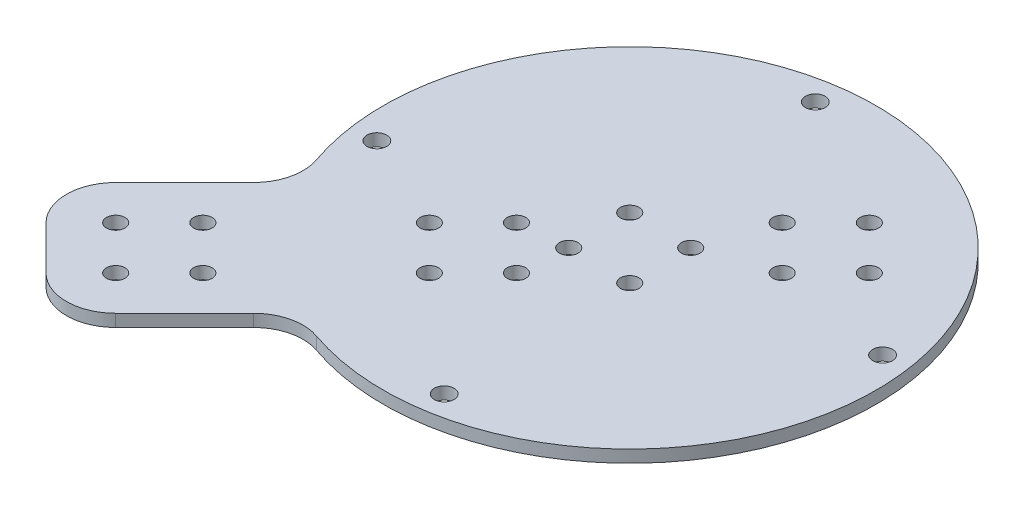
ISO-10303-21;
HEADER;
FILE_DESCRIPTION(('STEP AP214'),'2;1');
FILE_NAME('part.step','',(''),(''),'','','');
FILE_SCHEMA(('AUTOMOTIVE_DESIGN { 1 0 10303 214 1 1 1 1 }'));
ENDSEC;
DATA;
#1=APPLICATION_CONTEXT('core data for automotive mechanical design processes');
#2=APPLICATION_PROTOCOL_DEFINITION('international standard','automotive_design',2000,#1);
#3=PRODUCT_CONTEXT('',#1,'mechanical');
#4=PRODUCT('Part','Part','',(#3));
#5=PRODUCT_RELATED_PRODUCT_CATEGORY('part','',(#4));
#6=PRODUCT_DEFINITION_FORMATION('','',#4);
#7=PRODUCT_DEFINITION_CONTEXT('part definition',#1,'design');
#8=PRODUCT_DEFINITION('design','',#6,#7);
#9=PRODUCT_DEFINITION_SHAPE('','',#8);
#10=(LENGTH_UNIT() NAMED_UNIT(*) SI_UNIT(.MILLI.,.METRE.));
#11=(NAMED_UNIT(*) PLANE_ANGLE_UNIT() SI_UNIT($,.RADIAN.));
#12=(NAMED_UNIT(*) SI_UNIT($,.STERADIAN.) SOLID_ANGLE_UNIT());
#13=UNCERTAINTY_MEASURE_WITH_UNIT(LENGTH_MEASURE(1.E-05),#10,'distance_accuracy_value','');
#14=(GEOMETRIC_REPRESENTATION_CONTEXT(3) GLOBAL_UNCERTAINTY_ASSIGNED_CONTEXT((#13)) GLOBAL_UNIT_ASSIGNED_CONTEXT((#10,
#11,#12)) REPRESENTATION_CONTEXT('',''));
#15=CARTESIAN_POINT('',(0.,0.,0.));
#16=DIRECTION('',(0.,0.,1.));
#17=DIRECTION('',(1.,0.,0.));
#18=AXIS2_PLACEMENT_3D('',#15,#16,#17);
#19=CARTESIAN_POINT('',(-12.7279220618098,2.,5.65685424847547));
#20=DIRECTION('',(0.,-1.,0.));
#21=DIRECTION('',(0.,0.,-1.));
#22=AXIS2_PLACEMENT_3D('',#19,#20,#21);
#23=CYLINDRICAL_SURFACE('',#22,1.5);
#24=CARTESIAN_POINT('',(-12.7279220618098,2.,5.65685424847547));
#25=DIRECTION('',(0.,1.,0.));
#26=DIRECTION('',(0.,0.,1.));
#27=AXIS2_PLACEMENT_3D('',#24,#25,#26);
#28=CIRCLE('',#27,1.5);
#29=CARTESIAN_POINT('',(-12.7279220618098,2.,7.15685424847547));
#30=VERTEX_POINT('',#29);
#31=EDGE_CURVE('E368',#30,#30,#28,.T.);
#32=ORIENTED_EDGE('',*,*,#31,.T.);
#33=EDGE_LOOP('',(#32));
#34=FACE_BOUND('',#33,.T.);
#35=CARTESIAN_POINT('',(-12.7279220618098,0.,5.65685424847547));
#36=DIRECTION('',(0.,1.,0.));
#37=DIRECTION('',(0.,0.,1.));
#38=AXIS2_PLACEMENT_3D('',#35,#36,#37);
#39=CIRCLE('',#38,1.5);
#40=CARTESIAN_POINT('',(-12.7279220618098,0.,7.15685424847547));
#41=VERTEX_POINT('',#40);
#42=EDGE_CURVE('E145',#41,#41,#39,.T.);
#43=ORIENTED_EDGE('',*,*,#42,.F.);
#44=EDGE_LOOP('',(#43));
#45=FACE_BOUND('',#44,.T.);
#46=ADVANCED_FACE('F47',(#34,#45),#23,.F.);
#47=CARTESIAN_POINT('',(-5.65685424847542,2.,12.7279220618098));
#48=DIRECTION('',(0.,-1.,0.));
#49=DIRECTION('',(0.,0.,-1.));
#50=AXIS2_PLACEMENT_3D('',#47,#48,#49);
#51=CYLINDRICAL_SURFACE('',#50,1.5);
#52=CARTESIAN_POINT('',(-5.65685424847542,2.,12.7279220618098));
#53=DIRECTION('',(0.,1.,0.));
#54=DIRECTION('',(0.,0.,1.));
#55=AXIS2_PLACEMENT_3D('',#52,#53,#54);
#56=CIRCLE('',#55,1.5);
#57=CARTESIAN_POINT('',(-5.65685424847542,2.,14.2279220618098));
#58=VERTEX_POINT('',#57);
#59=EDGE_CURVE('E364',#58,#58,#56,.T.);
#60=ORIENTED_EDGE('',*,*,#59,.T.);
#61=EDGE_LOOP('',(#60));
#62=FACE_BOUND('',#61,.T.);
#63=CARTESIAN_POINT('',(-5.65685424847542,0.,12.7279220618098));
#64=DIRECTION('',(0.,1.,0.));
#65=DIRECTION('',(0.,0.,1.));
#66=AXIS2_PLACEMENT_3D('',#63,#64,#65);
#67=CIRCLE('',#66,1.5);
#68=CARTESIAN_POINT('',(-5.65685424847542,0.,14.2279220618098));
#69=VERTEX_POINT('',#68);
#70=EDGE_CURVE('E153',#69,#69,#67,.T.);
#71=ORIENTED_EDGE('',*,*,#70,.F.);
#72=EDGE_LOOP('',(#71));
#73=FACE_BOUND('',#72,.T.);
#74=ADVANCED_FACE('F209',(#62,#73),#51,.F.);
#75=CARTESIAN_POINT('',(-19.7989898736917,2.,12.7279220606293));
#76=DIRECTION('',(0.,-1.,0.));
#77=DIRECTION('',(0.,0.,-1.));
#78=AXIS2_PLACEMENT_3D('',#75,#76,#77);
#79=CYLINDRICAL_SURFACE('',#78,1.5);
#80=CARTESIAN_POINT('',(-19.7989898736917,2.,12.7279220606293));
#81=DIRECTION('',(0.,1.,0.));
#82=DIRECTION('',(0.,0.,1.));
#83=AXIS2_PLACEMENT_3D('',#80,#81,#82);
#84=CIRCLE('',#83,1.5);
#85=CARTESIAN_POINT('',(-19.7989898736917,2.,14.2279220606293));
#86=VERTEX_POINT('',#85);
#87=EDGE_CURVE('E360',#86,#86,#84,.T.);
#88=ORIENTED_EDGE('',*,*,#87,.T.);
#89=EDGE_LOOP('',(#88));
#90=FACE_BOUND('',#89,.T.);
#91=CARTESIAN_POINT('',(-19.7989898736917,0.,12.7279220606293));
#92=DIRECTION('',(0.,1.,0.));
#93=DIRECTION('',(0.,0.,1.));
#94=AXIS2_PLACEMENT_3D('',#91,#92,#93);
#95=CIRCLE('',#94,1.5);
#96=CARTESIAN_POINT('',(-19.7989898736917,0.,14.2279220606293));
#97=VERTEX_POINT('',#96);
#98=EDGE_CURVE('E408',#97,#97,#95,.T.);
#99=ORIENTED_EDGE('',*,*,#98,.F.);
#100=EDGE_LOOP('',(#99));
#101=FACE_BOUND('',#100,.T.);
#102=ADVANCED_FACE('F215',(#90,#101),#79,.F.);
#103=CARTESIAN_POINT('',(-12.7279220606295,2.,19.7989898736915));
#104=DIRECTION('',(0.,-1.,0.));
#105=DIRECTION('',(0.,0.,-1.));
#106=AXIS2_PLACEMENT_3D('',#103,#104,#105);
#107=CYLINDRICAL_SURFACE('',#106,1.5);
#108=CARTESIAN_POINT('',(-12.7279220606295,2.,19.7989898736915));
#109=DIRECTION('',(0.,1.,0.));
#110=DIRECTION('',(0.,0.,1.));
#111=AXIS2_PLACEMENT_3D('',#108,#109,#110);
#112=CIRCLE('',#111,1.5);
#113=CARTESIAN_POINT('',(-12.7279220606295,2.,21.2989898736915));
#114=VERTEX_POINT('',#113);
#115=EDGE_CURVE('E356',#114,#114,#112,.T.);
#116=ORIENTED_EDGE('',*,*,#115,.T.);
#117=EDGE_LOOP('',(#116));
#118=FACE_BOUND('',#117,.T.);
#119=CARTESIAN_POINT('',(-12.7279220606295,0.,19.7989898736915));
#120=DIRECTION('',(0.,1.,0.));
#121=DIRECTION('',(0.,0.,1.));
#122=AXIS2_PLACEMENT_3D('',#119,#120,#121);
#123=CIRCLE('',#122,1.5);
#124=CARTESIAN_POINT('',(-12.7279220606295,0.,21.2989898736915));
#125=VERTEX_POINT('',#124);
#126=EDGE_CURVE('E404',#125,#125,#123,.T.);
#127=ORIENTED_EDGE('',*,*,#126,.F.);
#128=EDGE_LOOP('',(#127));
#129=FACE_BOUND('',#128,.T.);
#130=ADVANCED_FACE('F225',(#118,#129),#107,.F.);
#131=CARTESIAN_POINT('',(4.94974746830582,2.,-4.94974746830584));
#132=DIRECTION('',(0.,-1.,0.));
#133=DIRECTION('',(0.,0.,-1.));
#134=AXIS2_PLACEMENT_3D('',#131,#132,#133);
#135=CYLINDRICAL_SURFACE('',#134,1.5);
#136=CARTESIAN_POINT('',(4.94974746830582,2.,-4.94974746830584));
#137=DIRECTION('',(0.,1.,0.));
#138=DIRECTION('',(0.,0.,1.));
#139=AXIS2_PLACEMENT_3D('',#136,#137,#138);
#140=CIRCLE('',#139,1.5);
#141=CARTESIAN_POINT('',(4.94974746830582,2.,-3.44974746830584));
#142=VERTEX_POINT('',#141);
#143=EDGE_CURVE('E352',#142,#142,#140,.T.);
#144=ORIENTED_EDGE('',*,*,#143,.T.);
#145=EDGE_LOOP('',(#144));
#146=FACE_BOUND('',#145,.T.);
#147=CARTESIAN_POINT('',(4.94974746830582,0.,-4.94974746830584));
#148=DIRECTION('',(0.,1.,0.));
#149=DIRECTION('',(0.,0.,1.));
#150=AXIS2_PLACEMENT_3D('',#147,#148,#149);
#151=CIRCLE('',#150,1.5);
#152=CARTESIAN_POINT('',(4.94974746830582,0.,-3.44974746830584));
#153=VERTEX_POINT('',#152);
#154=EDGE_CURVE('E400',#153,#153,#151,.T.);
#155=ORIENTED_EDGE('',*,*,#154,.F.);
#156=EDGE_LOOP('',(#155));
#157=FACE_BOUND('',#156,.T.);
#158=ADVANCED_FACE('F229',(#146,#157),#135,.F.);
#159=CARTESIAN_POINT('',(-4.94974746830582,2.,-4.94974746830584));
#160=DIRECTION('',(0.,-1.,0.));
#161=DIRECTION('',(0.,0.,-1.));
#162=AXIS2_PLACEMENT_3D('',#159,#160,#161);
#163=CYLINDRICAL_SURFACE('',#162,1.5);
#164=CARTESIAN_POINT('',(-4.94974746830582,2.,-4.94974746830584));
#165=DIRECTION('',(0.,1.,0.));
#166=DIRECTION('',(0.,0.,1.));
#167=AXIS2_PLACEMENT_3D('',#164,#165,#166);
#168=CIRCLE('',#167,1.5);
#169=CARTESIAN_POINT('',(-4.94974746830582,2.,-3.44974746830584));
#170=VERTEX_POINT('',#169);
#171=EDGE_CURVE('E348',#170,#170,#168,.T.);
#172=ORIENTED_EDGE('',*,*,#171,.T.);
#173=EDGE_LOOP('',(#172));
#174=FACE_BOUND('',#173,.T.);
#175=CARTESIAN_POINT('',(-4.94974746830582,0.,-4.94974746830584));
#176=DIRECTION('',(0.,1.,0.));
#177=DIRECTION('',(0.,0.,1.));
#178=AXIS2_PLACEMENT_3D('',#175,#176,#177);
#179=CIRCLE('',#178,1.5);
#180=CARTESIAN_POINT('',(-4.94974746830582,0.,-3.44974746830584));
#181=VERTEX_POINT('',#180);
#182=EDGE_CURVE('E396',#181,#181,#179,.T.);
#183=ORIENTED_EDGE('',*,*,#182,.F.);
#184=EDGE_LOOP('',(#183));
#185=FACE_BOUND('',#184,.T.);
#186=ADVANCED_FACE('F233',(#174,#185),#163,.F.);
#187=CARTESIAN_POINT('',(-4.94974746830582,2.,4.94974746830584));
#188=DIRECTION('',(0.,-1.,0.));
#189=DIRECTION('',(0.,0.,-1.));
#190=AXIS2_PLACEMENT_3D('',#187,#188,#189);
#191=CYLINDRICAL_SURFACE('',#190,1.5);
#192=CARTESIAN_POINT('',(-4.94974746830582,2.,4.94974746830584));
#193=DIRECTION('',(0.,1.,0.));
#194=DIRECTION('',(0.,0.,1.));
#195=AXIS2_PLACEMENT_3D('',#192,#193,#194);
#196=CIRCLE('',#195,1.5);
#197=CARTESIAN_POINT('',(-4.94974746830582,2.,6.44974746830584));
#198=VERTEX_POINT('',#197);
#199=EDGE_CURVE('E344',#198,#198,#196,.T.);
#200=ORIENTED_EDGE('',*,*,#199,.T.);
#201=EDGE_LOOP('',(#200));
#202=FACE_BOUND('',#201,.T.);
#203=CARTESIAN_POINT('',(-4.94974746830582,0.,4.94974746830584));
#204=DIRECTION('',(0.,1.,0.));
#205=DIRECTION('',(0.,0.,1.));
#206=AXIS2_PLACEMENT_3D('',#203,#204,#205);
#207=CIRCLE('',#206,1.5);
#208=CARTESIAN_POINT('',(-4.94974746830582,0.,6.44974746830584));
#209=VERTEX_POINT('',#208);
#210=EDGE_CURVE('E392',#209,#209,#207,.T.);
#211=ORIENTED_EDGE('',*,*,#210,.F.);
#212=EDGE_LOOP('',(#211));
#213=FACE_BOUND('',#212,.T.);
#214=ADVANCED_FACE('F237',(#202,#213),#191,.F.);
#215=CARTESIAN_POINT('',(4.94974746830582,2.,4.94974746830584));
#216=DIRECTION('',(0.,-1.,0.));
#217=DIRECTION('',(0.,0.,-1.));
#218=AXIS2_PLACEMENT_3D('',#215,#216,#217);
#219=CYLINDRICAL_SURFACE('',#218,1.5);
#220=CARTESIAN_POINT('',(4.94974746830582,2.,4.94974746830584));
#221=DIRECTION('',(0.,1.,0.));
#222=DIRECTION('',(0.,0.,1.));
#223=AXIS2_PLACEMENT_3D('',#220,#221,#222);
#224=CIRCLE('',#223,1.5);
#225=CARTESIAN_POINT('',(4.94974746830582,2.,6.44974746830584));
#226=VERTEX_POINT('',#225);
#227=EDGE_CURVE('E340',#226,#226,#224,.T.);
#228=ORIENTED_EDGE('',*,*,#227,.T.);
#229=EDGE_LOOP('',(#228));
#230=FACE_BOUND('',#229,.T.);
#231=CARTESIAN_POINT('',(4.94974746830582,0.,4.94974746830584));
#232=DIRECTION('',(0.,1.,0.));
#233=DIRECTION('',(0.,0.,1.));
#234=AXIS2_PLACEMENT_3D('',#231,#232,#233);
#235=CIRCLE('',#234,1.5);
#236=CARTESIAN_POINT('',(4.94974746830582,0.,6.44974746830584));
#237=VERTEX_POINT('',#236);
#238=EDGE_CURVE('E388',#237,#237,#235,.T.);
#239=ORIENTED_EDGE('',*,*,#238,.F.);
#240=EDGE_LOOP('',(#239));
#241=FACE_BOUND('',#240,.T.);
#242=ADVANCED_FACE('F241',(#230,#241),#219,.F.);
#243=CARTESIAN_POINT('',(35.582997469406,2.,-5.46354199144189));
#244=DIRECTION('',(0.,-1.,0.));
#245=DIRECTION('',(0.,0.,-1.));
#246=AXIS2_PLACEMENT_3D('',#243,#244,#245);
#247=CYLINDRICAL_SURFACE('',#246,1.6);
#248=CARTESIAN_POINT('',(35.582997469406,2.,-5.46354199144189));
#249=DIRECTION('',(0.,1.,0.));
#250=DIRECTION('',(0.,0.,1.));
#251=AXIS2_PLACEMENT_3D('',#248,#249,#250);
#252=CIRCLE('',#251,1.6);
#253=CARTESIAN_POINT('',(35.582997469406,2.,-3.86354199144189));
#254=VERTEX_POINT('',#253);
#255=EDGE_CURVE('E336',#254,#254,#252,.T.);
#256=ORIENTED_EDGE('',*,*,#255,.T.);
#257=EDGE_LOOP('',(#256));
#258=FACE_BOUND('',#257,.T.);
#259=CARTESIAN_POINT('',(35.582997469406,0.,-5.46354199144189));
#260=DIRECTION('',(0.,1.,0.));
#261=DIRECTION('',(0.,0.,1.));
#262=AXIS2_PLACEMENT_3D('',#259,#260,#261);
#263=CIRCLE('',#262,1.6);
#264=CARTESIAN_POINT('',(35.582997469406,0.,-3.86354199144189));
#265=VERTEX_POINT('',#264);
#266=EDGE_CURVE('E384',#265,#265,#263,.T.);
#267=ORIENTED_EDGE('',*,*,#266,.F.);
#268=EDGE_LOOP('',(#267));
#269=FACE_BOUND('',#268,.T.);
#270=ADVANCED_FACE('F245',(#258,#269),#247,.F.);
#271=CARTESIAN_POINT('',(5.46354199144189,2.,35.582997469406));
#272=DIRECTION('',(0.,-1.,0.));
#273=DIRECTION('',(0.,0.,-1.));
#274=AXIS2_PLACEMENT_3D('',#271,#272,#273);
#275=CYLINDRICAL_SURFACE('',#274,1.6);
#276=CARTESIAN_POINT('',(5.46354199144189,2.,35.582997469406));
#277=DIRECTION('',(0.,1.,0.));
#278=DIRECTION('',(0.,0.,1.));
#279=AXIS2_PLACEMENT_3D('',#276,#277,#278);
#280=CIRCLE('',#279,1.6);
#281=CARTESIAN_POINT('',(5.46354199144189,2.,37.182997469406));
#282=VERTEX_POINT('',#281);
#283=EDGE_CURVE('E332',#282,#282,#280,.T.);
#284=ORIENTED_EDGE('',*,*,#283,.T.);
#285=EDGE_LOOP('',(#284));
#286=FACE_BOUND('',#285,.T.);
#287=CARTESIAN_POINT('',(5.46354199144189,0.,35.582997469406));
#288=DIRECTION('',(0.,1.,0.));
#289=DIRECTION('',(0.,0.,1.));
#290=AXIS2_PLACEMENT_3D('',#287,#288,#289);
#291=CIRCLE('',#290,1.6);
#292=CARTESIAN_POINT('',(5.46354199144189,0.,37.182997469406));
#293=VERTEX_POINT('',#292);
#294=EDGE_CURVE('E380',#293,#293,#291,.T.);
#295=ORIENTED_EDGE('',*,*,#294,.F.);
#296=EDGE_LOOP('',(#295));
#297=FACE_BOUND('',#296,.T.);
#298=ADVANCED_FACE('F249',(#286,#297),#275,.F.);
#299=CARTESIAN_POINT('',(-35.582997469406,2.,5.46354199144189));
#300=DIRECTION('',(0.,-1.,0.));
#301=DIRECTION('',(0.,0.,-1.));
#302=AXIS2_PLACEMENT_3D('',#299,#300,#301);
#303=CYLINDRICAL_SURFACE('',#302,1.6);
#304=CARTESIAN_POINT('',(-35.582997469406,2.,5.46354199144189));
#305=DIRECTION('',(0.,1.,0.));
#306=DIRECTION('',(0.,0.,1.));
#307=AXIS2_PLACEMENT_3D('',#304,#305,#306);
#308=CIRCLE('',#307,1.6);
#309=CARTESIAN_POINT('',(-35.582997469406,2.,7.06354199144189));
#310=VERTEX_POINT('',#309);
#311=EDGE_CURVE('E150',#310,#310,#308,.T.);
#312=ORIENTED_EDGE('',*,*,#311,.T.);
#313=EDGE_LOOP('',(#312));
#314=FACE_BOUND('',#313,.T.);
#315=CARTESIAN_POINT('',(-35.582997469406,0.,5.46354199144189));
#316=DIRECTION('',(0.,1.,0.));
#317=DIRECTION('',(0.,0.,1.));
#318=AXIS2_PLACEMENT_3D('',#315,#316,#317);
#319=CIRCLE('',#318,1.6);
#320=CARTESIAN_POINT('',(-35.582997469406,0.,7.06354199144189));
#321=VERTEX_POINT('',#320);
#322=EDGE_CURVE('E376',#321,#321,#319,.T.);
#323=ORIENTED_EDGE('',*,*,#322,.F.);
#324=EDGE_LOOP('',(#323));
#325=FACE_BOUND('',#324,.T.);
#326=ADVANCED_FACE('F253',(#314,#325),#303,.F.);
#327=CARTESIAN_POINT('',(-5.46354199144189,2.,-35.582997469406));
#328=DIRECTION('',(0.,-1.,0.));
#329=DIRECTION('',(0.,0.,-1.));
#330=AXIS2_PLACEMENT_3D('',#327,#328,#329);
#331=CYLINDRICAL_SURFACE('',#330,1.6);
#332=CARTESIAN_POINT('',(-5.46354199144189,2.,-35.582997469406));
#333=DIRECTION('',(0.,1.,0.));
#334=DIRECTION('',(0.,0.,1.));
#335=AXIS2_PLACEMENT_3D('',#332,#333,#334);
#336=CIRCLE('',#335,1.6);
#337=CARTESIAN_POINT('',(-5.46354199144189,2.,-33.982997469406));
#338=VERTEX_POINT('',#337);
#339=EDGE_CURVE('E144',#338,#338,#336,.T.);
#340=ORIENTED_EDGE('',*,*,#339,.T.);
#341=EDGE_LOOP('',(#340));
#342=FACE_BOUND('',#341,.T.);
#343=CARTESIAN_POINT('',(-5.46354199144189,0.,-35.582997469406));
#344=DIRECTION('',(0.,1.,0.));
#345=DIRECTION('',(0.,0.,1.));
#346=AXIS2_PLACEMENT_3D('',#343,#344,#345);
#347=CIRCLE('',#346,1.6);
#348=CARTESIAN_POINT('',(-5.46354199144189,0.,-33.982997469406));
#349=VERTEX_POINT('',#348);
#350=EDGE_CURVE('E301',#349,#349,#347,.T.);
#351=ORIENTED_EDGE('',*,*,#350,.F.);
#352=EDGE_LOOP('',(#351));
#353=FACE_BOUND('',#352,.T.);
#354=ADVANCED_FACE('F257',(#342,#353),#331,.F.);
#355=CARTESIAN_POINT('',(0.,2.,0.));
#356=DIRECTION('',(0.,-1.,0.));
#357=DIRECTION('',(0.,0.,-1.));
#358=AXIS2_PLACEMENT_3D('',#355,#356,#357);
#359=CYLINDRICAL_SURFACE('',#358,40.);
#360=CARTESIAN_POINT('',(0.,2.,0.));
#361=DIRECTION('',(0.,1.,0.));
#362=DIRECTION('',(0.,0.,1.));
#363=AXIS2_PLACEMENT_3D('',#360,#361,#362);
#364=CIRCLE('',#363,40.);
#365=CARTESIAN_POINT('',(-13.0593687647406,2.,37.8081061079039));
#366=VERTEX_POINT('',#365);
#367=CARTESIAN_POINT('',(-37.8081061070648,2.,13.0593687671698));
#368=VERTEX_POINT('',#367);
#369=EDGE_CURVE('E135',#366,#368,#364,.T.);
#370=ORIENTED_EDGE('',*,*,#369,.F.);
#371=DIRECTION('',(0.,-1.,0.));
#372=VECTOR('',#371,1.);
#373=CARTESIAN_POINT('',(-13.0593687647406,2.,37.8081061079039));
#374=LINE('',#373,#372);
#375=CARTESIAN_POINT('',(-13.0593687647406,0.,37.8081061079039));
#376=VERTEX_POINT('',#375);
#377=EDGE_CURVE('E118',#366,#376,#374,.T.);
#378=ORIENTED_EDGE('',*,*,#377,.T.);
#379=CARTESIAN_POINT('',(0.,0.,0.));
#380=DIRECTION('',(0.,1.,0.));
#381=DIRECTION('',(0.,0.,1.));
#382=AXIS2_PLACEMENT_3D('',#379,#380,#381);
#383=CIRCLE('',#382,40.);
#384=CARTESIAN_POINT('',(-37.8081061070648,0.,13.0593687671698));
#385=VERTEX_POINT('',#384);
#386=EDGE_CURVE('E132',#376,#385,#383,.T.);
#387=ORIENTED_EDGE('',*,*,#386,.T.);
#388=DIRECTION('',(0.,-1.,0.));
#389=VECTOR('',#388,1.);
#390=CARTESIAN_POINT('',(-37.8081061070648,2.,13.0593687671698));
#391=LINE('',#390,#389);
#392=EDGE_CURVE('E138',#385,#368,#391,.F.);
#393=ORIENTED_EDGE('',*,*,#392,.T.);
#394=EDGE_LOOP('',(#370,#378,#387,#393));
#395=FACE_BOUND('',#394,.T.);
#396=ADVANCED_FACE('F130',(#395),#359,.T.);
#397=CARTESIAN_POINT('',(0.,2.,0.));
#398=DIRECTION('',(0.,1.,0.));
#399=DIRECTION('',(0.,0.,1.));
#400=AXIS2_PLACEMENT_3D('',#397,#398,#399);
#401=PLANE('',#400);
#402=DIRECTION('',(0.707106781186547,0.,0.707106781186548));
#403=VECTOR('',#402,1.);
#404=CARTESIAN_POINT('',(-38.183766182752,2.,56.5685424955632));
#405=LINE('',#404,#403);
#406=CARTESIAN_POINT('',(-50.9116882441098,2.,43.8406204342053));
#407=VERTEX_POINT('',#406);
#408=CARTESIAN_POINT('',(-43.8406204322443,2.,50.9116882460708));
#409=VERTEX_POINT('',#408);
#410=EDGE_CURVE('E290',#407,#409,#405,.T.);
#411=ORIENTED_EDGE('',*,*,#410,.T.);
#412=CARTESIAN_POINT('',(-38.183766182752,2.,45.2548339965784));
#413=DIRECTION('',(0.,1.,0.));
#414=DIRECTION('',(0.,0.,1.));
#415=AXIS2_PLACEMENT_3D('',#412,#413,#414);
#416=CIRCLE('',#415,8.);
#417=CARTESIAN_POINT('',(-32.5269119332596,2.,50.9116882460708));
#418=VERTEX_POINT('',#417);
#419=EDGE_CURVE('E173',#409,#418,#416,.T.);
#420=ORIENTED_EDGE('',*,*,#419,.T.);
#421=DIRECTION('',(0.707106781186547,0.,-0.707106781186548));
#422=VECTOR('',#421,1.);
#423=CARTESIAN_POINT('',(-38.183766182752,2.,56.5685424955632));
#424=LINE('',#423,#422);
#425=CARTESIAN_POINT('',(-21.3280967671811,2.,39.7128730799923));
#426=VERTEX_POINT('',#425);
#427=EDGE_CURVE('E199',#418,#426,#424,.T.);
#428=ORIENTED_EDGE('',*,*,#427,.T.);
#429=CARTESIAN_POINT('',(-15.6712425176887,2.,45.3697273294847));
#430=DIRECTION('',(0.,1.,0.));
#431=DIRECTION('',(0.,0.,1.));
#432=AXIS2_PLACEMENT_3D('',#429,#430,#431);
#433=CIRCLE('',#432,8.);
#434=EDGE_CURVE('E124',#426,#366,#433,.F.);
#435=ORIENTED_EDGE('',*,*,#434,.T.);
#436=ORIENTED_EDGE('',*,*,#369,.T.);
#437=CARTESIAN_POINT('',(-45.3697273284778,2.,15.6712425206037));
#438=DIRECTION('',(0.,1.,0.));
#439=DIRECTION('',(0.,0.,1.));
#440=AXIS2_PLACEMENT_3D('',#437,#438,#439);
#441=CIRCLE('',#440,8.);
#442=CARTESIAN_POINT('',(-39.7128730789854,2.,21.3280967700961));
#443=VERTEX_POINT('',#442);
#444=EDGE_CURVE('E56',#368,#443,#441,.F.);
#445=ORIENTED_EDGE('',*,*,#444,.T.);
#446=DIRECTION('',(-0.707106781186547,0.,0.707106781186547));
#447=VECTOR('',#446,1.);
#448=CARTESIAN_POINT('',(-56.5685424936022,2.,38.1837661847129));
#449=LINE('',#448,#447);
#450=CARTESIAN_POINT('',(-50.9116882441098,2.,32.5269119352205));
#451=VERTEX_POINT('',#450);
#452=EDGE_CURVE('E193',#443,#451,#449,.T.);
#453=ORIENTED_EDGE('',*,*,#452,.T.);
#454=CARTESIAN_POINT('',(-45.2548339946174,2.,38.1837661847129));
#455=DIRECTION('',(0.,1.,0.));
#456=DIRECTION('',(0.,0.,1.));
#457=AXIS2_PLACEMENT_3D('',#454,#455,#456);
#458=CIRCLE('',#457,8.);
#459=EDGE_CURVE('E170',#451,#407,#458,.T.);
#460=ORIENTED_EDGE('',*,*,#459,.T.);
#461=EDGE_LOOP('',(#411,#420,#428,#435,#436,#445,#453,#460));
#462=FACE_BOUND('',#461,.T.);
#463=CARTESIAN_POINT('',(8.83883476508806,2.,-15.909902576555));
#464=DIRECTION('',(0.,1.,0.));
#465=DIRECTION('',(0.,0.,1.));
#466=AXIS2_PLACEMENT_3D('',#463,#464,#465);
#467=CIRCLE('',#466,1.5);
#468=CARTESIAN_POINT('',(8.83883476508806,2.,-14.409902576555));
#469=VERTEX_POINT('',#468);
#470=EDGE_CURVE('E302',#469,#469,#467,.T.);
#471=ORIENTED_EDGE('',*,*,#470,.F.);
#472=EDGE_LOOP('',(#471));
#473=FACE_BOUND('',#472,.T.);
#474=CARTESIAN_POINT('',(15.9099025765551,2.,-8.8388347650879));
#475=DIRECTION('',(0.,1.,0.));
#476=DIRECTION('',(0.,0.,1.));
#477=AXIS2_PLACEMENT_3D('',#474,#475,#476);
#478=CIRCLE('',#477,1.5);
#479=CARTESIAN_POINT('',(15.9099025765551,2.,-7.33883476508789));
#480=VERTEX_POINT('',#479);
#481=EDGE_CURVE('E306',#480,#480,#478,.T.);
#482=ORIENTED_EDGE('',*,*,#481,.F.);
#483=EDGE_LOOP('',(#482));
#484=FACE_BOUND('',#483,.T.);
#485=CARTESIAN_POINT('',(15.9099025762023,2.,-22.9809703889055));
#486=DIRECTION('',(0.,1.,0.));
#487=DIRECTION('',(0.,0.,1.));
#488=AXIS2_PLACEMENT_3D('',#485,#486,#487);
#489=CIRCLE('',#488,1.5);
#490=CARTESIAN_POINT('',(15.9099025762023,2.,-21.4809703889055));
#491=VERTEX_POINT('',#490);
#492=EDGE_CURVE('E314',#491,#491,#489,.T.);
#493=ORIENTED_EDGE('',*,*,#492,.F.);
#494=EDGE_LOOP('',(#493));
#495=FACE_BOUND('',#494,.T.);
#496=CARTESIAN_POINT('',(22.9809703889056,2.,-15.9099025762021));
#497=DIRECTION('',(0.,1.,0.));
#498=DIRECTION('',(0.,0.,1.));
#499=AXIS2_PLACEMENT_3D('',#496,#497,#498);
#500=CIRCLE('',#499,1.5);
#501=CARTESIAN_POINT('',(22.9809703889056,2.,-14.4099025762021));
#502=VERTEX_POINT('',#501);
#503=EDGE_CURVE('E322',#502,#502,#500,.T.);
#504=ORIENTED_EDGE('',*,*,#503,.F.);
#505=EDGE_LOOP('',(#504));
#506=FACE_BOUND('',#505,.T.);
#507=ORIENTED_EDGE('',*,*,#339,.F.);
#508=EDGE_LOOP('',(#507));
#509=FACE_BOUND('',#508,.T.);
#510=ORIENTED_EDGE('',*,*,#311,.F.);
#511=EDGE_LOOP('',(#510));
#512=FACE_BOUND('',#511,.T.);
#513=ORIENTED_EDGE('',*,*,#283,.F.);
#514=EDGE_LOOP('',(#513));
#515=FACE_BOUND('',#514,.T.);
#516=ORIENTED_EDGE('',*,*,#255,.F.);
#517=EDGE_LOOP('',(#516));
#518=FACE_BOUND('',#517,.T.);
#519=ORIENTED_EDGE('',*,*,#227,.F.);
#520=EDGE_LOOP('',(#519));
#521=FACE_BOUND('',#520,.T.);
#522=ORIENTED_EDGE('',*,*,#199,.F.);
#523=EDGE_LOOP('',(#522));
#524=FACE_BOUND('',#523,.T.);
#525=ORIENTED_EDGE('',*,*,#171,.F.);
#526=EDGE_LOOP('',(#525));
#527=FACE_BOUND('',#526,.T.);
#528=ORIENTED_EDGE('',*,*,#143,.F.);
#529=EDGE_LOOP('',(#528));
#530=FACE_BOUND('',#529,.T.);
#531=ORIENTED_EDGE('',*,*,#115,.F.);
#532=EDGE_LOOP('',(#531));
#533=FACE_BOUND('',#532,.T.);
#534=ORIENTED_EDGE('',*,*,#87,.F.);
#535=EDGE_LOOP('',(#534));
#536=FACE_BOUND('',#535,.T.);
#537=ORIENTED_EDGE('',*,*,#59,.F.);
#538=EDGE_LOOP('',(#537));
#539=FACE_BOUND('',#538,.T.);
#540=ORIENTED_EDGE('',*,*,#31,.F.);
#541=EDGE_LOOP('',(#540));
#542=FACE_BOUND('',#541,.T.);
#543=CARTESIAN_POINT('',(-31.1126983719123,2.,38.1837661843146));
#544=DIRECTION('',(0.,1.,0.));
#545=DIRECTION('',(0.,0.,1.));
#546=AXIS2_PLACEMENT_3D('',#543,#544,#545);
#547=CIRCLE('',#546,1.5);
#548=CARTESIAN_POINT('',(-31.1126983719123,2.,39.6837661843146));
#549=VERTEX_POINT('',#548);
#550=EDGE_CURVE('E452',#549,#549,#547,.T.);
#551=ORIENTED_EDGE('',*,*,#550,.F.);
#552=EDGE_LOOP('',(#551));
#553=FACE_BOUND('',#552,.T.);
#554=CARTESIAN_POINT('',(-38.1837661843145,2.,31.1126983719124));
#555=DIRECTION('',(0.,1.,0.));
#556=DIRECTION('',(0.,0.,1.));
#557=AXIS2_PLACEMENT_3D('',#554,#555,#556);
#558=CIRCLE('',#557,1.5);
#559=CARTESIAN_POINT('',(-38.1837661843145,2.,32.6126983719124));
#560=VERTEX_POINT('',#559);
#561=EDGE_CURVE('E446',#560,#560,#558,.T.);
#562=ORIENTED_EDGE('',*,*,#561,.F.);
#563=EDGE_LOOP('',(#562));
#564=FACE_BOUND('',#563,.T.);
#565=CARTESIAN_POINT('',(-38.1837661801883,2.,45.2548339992172));
#566=DIRECTION('',(0.,1.,0.));
#567=DIRECTION('',(0.,0.,1.));
#568=AXIS2_PLACEMENT_3D('',#565,#566,#567);
#569=CIRCLE('',#568,1.5);
#570=CARTESIAN_POINT('',(-38.1837661801883,2.,46.7548339992172));
#571=VERTEX_POINT('',#570);
#572=EDGE_CURVE('E440',#571,#571,#569,.T.);
#573=ORIENTED_EDGE('',*,*,#572,.F.);
#574=EDGE_LOOP('',(#573));
#575=FACE_BOUND('',#574,.T.);
#576=CARTESIAN_POINT('',(-45.2548339925528,2.,38.1837661880869));
#577=DIRECTION('',(0.,1.,0.));
#578=DIRECTION('',(0.,0.,1.));
#579=AXIS2_PLACEMENT_3D('',#576,#577,#578);
#580=CIRCLE('',#579,1.5);
#581=CARTESIAN_POINT('',(-45.2548339925528,2.,39.6837661880869));
#582=VERTEX_POINT('',#581);
#583=EDGE_CURVE('E284',#582,#582,#580,.T.);
#584=ORIENTED_EDGE('',*,*,#583,.F.);
#585=EDGE_LOOP('',(#584));
#586=FACE_BOUND('',#585,.T.);
#587=ADVANCED_FACE('F191',(#462,#473,#484,#495,#506,#509,#512,#515,#518,#521,#524,#527,#530,
#533,#536,#539,#542,#553,#564,#575,#586),#401,.T.);
#588=CARTESIAN_POINT('',(0.,0.,0.));
#589=DIRECTION('',(0.,1.,0.));
#590=DIRECTION('',(0.,0.,1.));
#591=AXIS2_PLACEMENT_3D('',#588,#589,#590);
#592=PLANE('',#591);
#593=DIRECTION('',(0.707106781186547,0.,-0.707106781186548));
#594=VECTOR('',#593,1.);
#595=CARTESIAN_POINT('',(-38.183766182752,0.,56.5685424955632));
#596=LINE('',#595,#594);
#597=CARTESIAN_POINT('',(-32.5269119332596,0.,50.9116882460708));
#598=VERTEX_POINT('',#597);
#599=CARTESIAN_POINT('',(-21.3280967671811,0.,39.7128730799923));
#600=VERTEX_POINT('',#599);
#601=EDGE_CURVE('E273',#598,#600,#596,.T.);
#602=ORIENTED_EDGE('',*,*,#601,.F.);
#603=CARTESIAN_POINT('',(-38.183766182752,0.,45.2548339965784));
#604=DIRECTION('',(0.,1.,0.));
#605=DIRECTION('',(0.,0.,1.));
#606=AXIS2_PLACEMENT_3D('',#603,#604,#605);
#607=CIRCLE('',#606,8.);
#608=CARTESIAN_POINT('',(-43.8406204322443,0.,50.9116882460708));
#609=VERTEX_POINT('',#608);
#610=EDGE_CURVE('E178',#598,#609,#607,.F.);
#611=ORIENTED_EDGE('',*,*,#610,.T.);
#612=DIRECTION('',(0.707106781186547,0.,0.707106781186548));
#613=VECTOR('',#612,1.);
#614=CARTESIAN_POINT('',(-38.183766182752,0.,56.5685424955632));
#615=LINE('',#614,#613);
#616=CARTESIAN_POINT('',(-50.9116882441098,0.,43.8406204342053));
#617=VERTEX_POINT('',#616);
#618=EDGE_CURVE('E198',#617,#609,#615,.T.);
#619=ORIENTED_EDGE('',*,*,#618,.F.);
#620=CARTESIAN_POINT('',(-45.2548339946174,0.,38.1837661847129));
#621=DIRECTION('',(0.,1.,0.));
#622=DIRECTION('',(0.,0.,1.));
#623=AXIS2_PLACEMENT_3D('',#620,#621,#622);
#624=CIRCLE('',#623,8.);
#625=CARTESIAN_POINT('',(-50.9116882441098,0.,32.5269119352205));
#626=VERTEX_POINT('',#625);
#627=EDGE_CURVE('E63',#617,#626,#624,.F.);
#628=ORIENTED_EDGE('',*,*,#627,.T.);
#629=DIRECTION('',(-0.707106781186547,0.,0.707106781186547));
#630=VECTOR('',#629,1.);
#631=CARTESIAN_POINT('',(-56.5685424936022,0.,38.1837661847129));
#632=LINE('',#631,#630);
#633=CARTESIAN_POINT('',(-39.7128730789854,0.,21.3280967700961));
#634=VERTEX_POINT('',#633);
#635=EDGE_CURVE('E281',#634,#626,#632,.T.);
#636=ORIENTED_EDGE('',*,*,#635,.F.);
#637=CARTESIAN_POINT('',(-45.3697273284778,0.,15.6712425206037));
#638=DIRECTION('',(0.,1.,0.));
#639=DIRECTION('',(0.,0.,1.));
#640=AXIS2_PLACEMENT_3D('',#637,#638,#639);
#641=CIRCLE('',#640,8.);
#642=EDGE_CURVE('E11',#634,#385,#641,.T.);
#643=ORIENTED_EDGE('',*,*,#642,.T.);
#644=ORIENTED_EDGE('',*,*,#386,.F.);
#645=CARTESIAN_POINT('',(-15.6712425176887,0.,45.3697273294847));
#646=DIRECTION('',(0.,1.,0.));
#647=DIRECTION('',(0.,0.,1.));
#648=AXIS2_PLACEMENT_3D('',#645,#646,#647);
#649=CIRCLE('',#648,8.);
#650=EDGE_CURVE('E114',#376,#600,#649,.T.);
#651=ORIENTED_EDGE('',*,*,#650,.T.);
#652=EDGE_LOOP('',(#602,#611,#619,#628,#636,#643,#644,#651));
#653=FACE_BOUND('',#652,.T.);
#654=CARTESIAN_POINT('',(8.83883476508806,0.,-15.909902576555));
#655=DIRECTION('',(0.,1.,0.));
#656=DIRECTION('',(0.,0.,1.));
#657=AXIS2_PLACEMENT_3D('',#654,#655,#656);
#658=CIRCLE('',#657,1.5);
#659=CARTESIAN_POINT('',(8.83883476508806,0.,-14.409902576555));
#660=VERTEX_POINT('',#659);
#661=EDGE_CURVE('E297',#660,#660,#658,.T.);
#662=ORIENTED_EDGE('',*,*,#661,.T.);
#663=EDGE_LOOP('',(#662));
#664=FACE_BOUND('',#663,.T.);
#665=CARTESIAN_POINT('',(15.9099025765551,0.,-8.8388347650879));
#666=DIRECTION('',(0.,1.,0.));
#667=DIRECTION('',(0.,0.,1.));
#668=AXIS2_PLACEMENT_3D('',#665,#666,#667);
#669=CIRCLE('',#668,1.5);
#670=CARTESIAN_POINT('',(15.9099025765551,0.,-7.33883476508789));
#671=VERTEX_POINT('',#670);
#672=EDGE_CURVE('E310',#671,#671,#669,.T.);
#673=ORIENTED_EDGE('',*,*,#672,.T.);
#674=EDGE_LOOP('',(#673));
#675=FACE_BOUND('',#674,.T.);
#676=CARTESIAN_POINT('',(15.9099025762023,0.,-22.9809703889055));
#677=DIRECTION('',(0.,1.,0.));
#678=DIRECTION('',(0.,0.,1.));
#679=AXIS2_PLACEMENT_3D('',#676,#677,#678);
#680=CIRCLE('',#679,1.5);
#681=CARTESIAN_POINT('',(15.9099025762023,0.,-21.4809703889055));
#682=VERTEX_POINT('',#681);
#683=EDGE_CURVE('E318',#682,#682,#680,.T.);
#684=ORIENTED_EDGE('',*,*,#683,.T.);
#685=EDGE_LOOP('',(#684));
#686=FACE_BOUND('',#685,.T.);
#687=CARTESIAN_POINT('',(22.9809703889056,0.,-15.9099025762021));
#688=DIRECTION('',(0.,1.,0.));
#689=DIRECTION('',(0.,0.,1.));
#690=AXIS2_PLACEMENT_3D('',#687,#688,#689);
#691=CIRCLE('',#690,1.5);
#692=CARTESIAN_POINT('',(22.9809703889056,0.,-14.4099025762021));
#693=VERTEX_POINT('',#692);
#694=EDGE_CURVE('E289',#693,#693,#691,.T.);
#695=ORIENTED_EDGE('',*,*,#694,.T.);
#696=EDGE_LOOP('',(#695));
#697=FACE_BOUND('',#696,.T.);
#698=ORIENTED_EDGE('',*,*,#350,.T.);
#699=EDGE_LOOP('',(#698));
#700=FACE_BOUND('',#699,.T.);
#701=ORIENTED_EDGE('',*,*,#322,.T.);
#702=EDGE_LOOP('',(#701));
#703=FACE_BOUND('',#702,.T.);
#704=ORIENTED_EDGE('',*,*,#294,.T.);
#705=EDGE_LOOP('',(#704));
#706=FACE_BOUND('',#705,.T.);
#707=ORIENTED_EDGE('',*,*,#266,.T.);
#708=EDGE_LOOP('',(#707));
#709=FACE_BOUND('',#708,.T.);
#710=ORIENTED_EDGE('',*,*,#238,.T.);
#711=EDGE_LOOP('',(#710));
#712=FACE_BOUND('',#711,.T.);
#713=ORIENTED_EDGE('',*,*,#210,.T.);
#714=EDGE_LOOP('',(#713));
#715=FACE_BOUND('',#714,.T.);
#716=ORIENTED_EDGE('',*,*,#182,.T.);
#717=EDGE_LOOP('',(#716));
#718=FACE_BOUND('',#717,.T.);
#719=ORIENTED_EDGE('',*,*,#154,.T.);
#720=EDGE_LOOP('',(#719));
#721=FACE_BOUND('',#720,.T.);
#722=ORIENTED_EDGE('',*,*,#126,.T.);
#723=EDGE_LOOP('',(#722));
#724=FACE_BOUND('',#723,.T.);
#725=ORIENTED_EDGE('',*,*,#98,.T.);
#726=EDGE_LOOP('',(#725));
#727=FACE_BOUND('',#726,.T.);
#728=ORIENTED_EDGE('',*,*,#70,.T.);
#729=EDGE_LOOP('',(#728));
#730=FACE_BOUND('',#729,.T.);
#731=ORIENTED_EDGE('',*,*,#42,.T.);
#732=EDGE_LOOP('',(#731));
#733=FACE_BOUND('',#732,.T.);
#734=CARTESIAN_POINT('',(-31.1126983719123,0.,38.1837661843146));
#735=DIRECTION('',(0.,1.,0.));
#736=DIRECTION('',(0.,0.,1.));
#737=AXIS2_PLACEMENT_3D('',#734,#735,#736);
#738=CIRCLE('',#737,1.5);
#739=CARTESIAN_POINT('',(-31.1126983719123,0.,39.6837661843146));
#740=VERTEX_POINT('',#739);
#741=EDGE_CURVE('E424',#740,#740,#738,.T.);
#742=ORIENTED_EDGE('',*,*,#741,.T.);
#743=EDGE_LOOP('',(#742));
#744=FACE_BOUND('',#743,.T.);
#745=CARTESIAN_POINT('',(-38.1837661843145,0.,31.1126983719124));
#746=DIRECTION('',(0.,1.,0.));
#747=DIRECTION('',(0.,0.,1.));
#748=AXIS2_PLACEMENT_3D('',#745,#746,#747);
#749=CIRCLE('',#748,1.5);
#750=CARTESIAN_POINT('',(-38.1837661843145,0.,32.6126983719124));
#751=VERTEX_POINT('',#750);
#752=EDGE_CURVE('E428',#751,#751,#749,.T.);
#753=ORIENTED_EDGE('',*,*,#752,.T.);
#754=EDGE_LOOP('',(#753));
#755=FACE_BOUND('',#754,.T.);
#756=CARTESIAN_POINT('',(-38.1837661801883,0.,45.2548339992172));
#757=DIRECTION('',(0.,1.,0.));
#758=DIRECTION('',(0.,0.,1.));
#759=AXIS2_PLACEMENT_3D('',#756,#757,#758);
#760=CIRCLE('',#759,1.5);
#761=CARTESIAN_POINT('',(-38.1837661801883,0.,46.7548339992172));
#762=VERTEX_POINT('',#761);
#763=EDGE_CURVE('E432',#762,#762,#760,.T.);
#764=ORIENTED_EDGE('',*,*,#763,.T.);
#765=EDGE_LOOP('',(#764));
#766=FACE_BOUND('',#765,.T.);
#767=CARTESIAN_POINT('',(-45.2548339925528,0.,38.1837661880869));
#768=DIRECTION('',(0.,1.,0.));
#769=DIRECTION('',(0.,0.,1.));
#770=AXIS2_PLACEMENT_3D('',#767,#768,#769);
#771=CIRCLE('',#770,1.5);
#772=CARTESIAN_POINT('',(-45.2548339925528,0.,39.6837661880869));
#773=VERTEX_POINT('',#772);
#774=EDGE_CURVE('E293',#773,#773,#771,.T.);
#775=ORIENTED_EDGE('',*,*,#774,.T.);
#776=EDGE_LOOP('',(#775));
#777=FACE_BOUND('',#776,.T.);
#778=ADVANCED_FACE('F140',(#653,#664,#675,#686,#697,#700,#703,#706,#709,#712,#715,#718,#721,
#724,#727,#730,#733,#744,#755,#766,#777),#592,.F.);
#779=CARTESIAN_POINT('',(22.9809703889056,0.,-15.9099025762021));
#780=DIRECTION('',(0.,1.,0.));
#781=DIRECTION('',(0.,0.,1.));
#782=AXIS2_PLACEMENT_3D('',#779,#780,#781);
#783=CYLINDRICAL_SURFACE('',#782,1.5);
#784=ORIENTED_EDGE('',*,*,#694,.F.);
#785=EDGE_LOOP('',(#784));
#786=FACE_BOUND('',#785,.T.);
#787=ORIENTED_EDGE('',*,*,#503,.T.);
#788=EDGE_LOOP('',(#787));
#789=FACE_BOUND('',#788,.T.);
#790=ADVANCED_FACE('F418',(#786,#789),#783,.F.);
#791=CARTESIAN_POINT('',(15.9099025762023,0.,-22.9809703889055));
#792=DIRECTION('',(0.,1.,0.));
#793=DIRECTION('',(0.,0.,1.));
#794=AXIS2_PLACEMENT_3D('',#791,#792,#793);
#795=CYLINDRICAL_SURFACE('',#794,1.5);
#796=ORIENTED_EDGE('',*,*,#683,.F.);
#797=EDGE_LOOP('',(#796));
#798=FACE_BOUND('',#797,.T.);
#799=ORIENTED_EDGE('',*,*,#492,.T.);
#800=EDGE_LOOP('',(#799));
#801=FACE_BOUND('',#800,.T.);
#802=ADVANCED_FACE('F496',(#798,#801),#795,.F.);
#803=CARTESIAN_POINT('',(15.9099025765551,0.,-8.8388347650879));
#804=DIRECTION('',(0.,1.,0.));
#805=DIRECTION('',(0.,0.,1.));
#806=AXIS2_PLACEMENT_3D('',#803,#804,#805);
#807=CYLINDRICAL_SURFACE('',#806,1.5);
#808=ORIENTED_EDGE('',*,*,#672,.F.);
#809=EDGE_LOOP('',(#808));
#810=FACE_BOUND('',#809,.T.);
#811=ORIENTED_EDGE('',*,*,#481,.T.);
#812=EDGE_LOOP('',(#811));
#813=FACE_BOUND('',#812,.T.);
#814=ADVANCED_FACE('F492',(#810,#813),#807,.F.);
#815=CARTESIAN_POINT('',(8.83883476508806,0.,-15.909902576555));
#816=DIRECTION('',(0.,1.,0.));
#817=DIRECTION('',(0.,0.,1.));
#818=AXIS2_PLACEMENT_3D('',#815,#816,#817);
#819=CYLINDRICAL_SURFACE('',#818,1.5);
#820=ORIENTED_EDGE('',*,*,#661,.F.);
#821=EDGE_LOOP('',(#820));
#822=FACE_BOUND('',#821,.T.);
#823=ORIENTED_EDGE('',*,*,#470,.T.);
#824=EDGE_LOOP('',(#823));
#825=FACE_BOUND('',#824,.T.);
#826=ADVANCED_FACE('F487',(#822,#825),#819,.F.);
#827=CARTESIAN_POINT('',(-56.5685424936022,0.,38.1837661847129));
#828=DIRECTION('',(-0.707106781186547,0.,-0.707106781186547));
#829=DIRECTION('',(-0.707106781186548,0.,0.707106781186548));
#830=AXIS2_PLACEMENT_3D('',#827,#828,#829);
#831=PLANE('',#830);
#832=ORIENTED_EDGE('',*,*,#635,.T.);
#833=DIRECTION('',(0.,1.,0.));
#834=VECTOR('',#833,1.);
#835=CARTESIAN_POINT('',(-50.9116882441098,0.,32.5269119352205));
#836=LINE('',#835,#834);
#837=EDGE_CURVE('E125',#626,#451,#836,.T.);
#838=ORIENTED_EDGE('',*,*,#837,.T.);
#839=ORIENTED_EDGE('',*,*,#452,.F.);
#840=DIRECTION('',(0.,-1.,0.));
#841=VECTOR('',#840,1.);
#842=CARTESIAN_POINT('',(-39.7128730789854,0.,21.3280967700961));
#843=LINE('',#842,#841);
#844=EDGE_CURVE('E70',#443,#634,#843,.T.);
#845=ORIENTED_EDGE('',*,*,#844,.T.);
#846=EDGE_LOOP('',(#832,#838,#839,#845));
#847=FACE_BOUND('',#846,.T.);
#848=ADVANCED_FACE('F195',(#847),#831,.T.);
#849=CARTESIAN_POINT('',(-38.183766182752,0.,56.5685424955632));
#850=DIRECTION('',(0.707106781186548,0.,0.707106781186547));
#851=DIRECTION('',(0.707106781186547,0.,-0.707106781186548));
#852=AXIS2_PLACEMENT_3D('',#849,#850,#851);
#853=PLANE('',#852);
#854=ORIENTED_EDGE('',*,*,#601,.T.);
#855=DIRECTION('',(0.,-1.,0.));
#856=VECTOR('',#855,1.);
#857=CARTESIAN_POINT('',(-21.3280967671811,0.,39.7128730799923));
#858=LINE('',#857,#856);
#859=EDGE_CURVE('E119',#600,#426,#858,.F.);
#860=ORIENTED_EDGE('',*,*,#859,.T.);
#861=ORIENTED_EDGE('',*,*,#427,.F.);
#862=DIRECTION('',(0.,1.,0.));
#863=VECTOR('',#862,1.);
#864=CARTESIAN_POINT('',(-32.5269119332596,0.,50.9116882460708));
#865=LINE('',#864,#863);
#866=EDGE_CURVE('E137',#418,#598,#865,.F.);
#867=ORIENTED_EDGE('',*,*,#866,.T.);
#868=EDGE_LOOP('',(#854,#860,#861,#867));
#869=FACE_BOUND('',#868,.T.);
#870=ADVANCED_FACE('F481',(#869),#853,.T.);
#871=CARTESIAN_POINT('',(-38.183766182752,0.,56.5685424955632));
#872=DIRECTION('',(-0.707106781186548,0.,0.707106781186547));
#873=DIRECTION('',(0.707106781186547,0.,0.707106781186548));
#874=AXIS2_PLACEMENT_3D('',#871,#872,#873);
#875=PLANE('',#874);
#876=ORIENTED_EDGE('',*,*,#618,.T.);
#877=DIRECTION('',(0.,1.,0.));
#878=VECTOR('',#877,1.);
#879=CARTESIAN_POINT('',(-43.8406204322443,0.,50.9116882460708));
#880=LINE('',#879,#878);
#881=EDGE_CURVE('E166',#609,#409,#880,.T.);
#882=ORIENTED_EDGE('',*,*,#881,.T.);
#883=ORIENTED_EDGE('',*,*,#410,.F.);
#884=DIRECTION('',(0.,1.,0.));
#885=VECTOR('',#884,1.);
#886=CARTESIAN_POINT('',(-50.9116882441098,0.,43.8406204342053));
#887=LINE('',#886,#885);
#888=EDGE_CURVE('E163',#407,#617,#887,.F.);
#889=ORIENTED_EDGE('',*,*,#888,.T.);
#890=EDGE_LOOP('',(#876,#882,#883,#889));
#891=FACE_BOUND('',#890,.T.);
#892=ADVANCED_FACE('F275',(#891),#875,.T.);
#893=CARTESIAN_POINT('',(-45.2548339925528,0.,38.1837661880869));
#894=DIRECTION('',(0.,1.,0.));
#895=DIRECTION('',(0.,0.,1.));
#896=AXIS2_PLACEMENT_3D('',#893,#894,#895);
#897=CYLINDRICAL_SURFACE('',#896,1.5);
#898=ORIENTED_EDGE('',*,*,#774,.F.);
#899=EDGE_LOOP('',(#898));
#900=FACE_BOUND('',#899,.T.);
#901=ORIENTED_EDGE('',*,*,#583,.T.);
#902=EDGE_LOOP('',(#901));
#903=FACE_BOUND('',#902,.T.);
#904=ADVANCED_FACE('F469',(#900,#903),#897,.F.);
#905=CARTESIAN_POINT('',(-38.1837661801883,0.,45.2548339992172));
#906=DIRECTION('',(0.,1.,0.));
#907=DIRECTION('',(0.,0.,1.));
#908=AXIS2_PLACEMENT_3D('',#905,#906,#907);
#909=CYLINDRICAL_SURFACE('',#908,1.5);
#910=ORIENTED_EDGE('',*,*,#763,.F.);
#911=EDGE_LOOP('',(#910));
#912=FACE_BOUND('',#911,.T.);
#913=ORIENTED_EDGE('',*,*,#572,.T.);
#914=EDGE_LOOP('',(#913));
#915=FACE_BOUND('',#914,.T.);
#916=ADVANCED_FACE('F471',(#912,#915),#909,.F.);
#917=CARTESIAN_POINT('',(-38.1837661843145,0.,31.1126983719124));
#918=DIRECTION('',(0.,1.,0.));
#919=DIRECTION('',(0.,0.,1.));
#920=AXIS2_PLACEMENT_3D('',#917,#918,#919);
#921=CYLINDRICAL_SURFACE('',#920,1.5);
#922=ORIENTED_EDGE('',*,*,#752,.F.);
#923=EDGE_LOOP('',(#922));
#924=FACE_BOUND('',#923,.T.);
#925=ORIENTED_EDGE('',*,*,#561,.T.);
#926=EDGE_LOOP('',(#925));
#927=FACE_BOUND('',#926,.T.);
#928=ADVANCED_FACE('F477',(#924,#927),#921,.F.);
#929=CARTESIAN_POINT('',(-31.1126983719123,0.,38.1837661843146));
#930=DIRECTION('',(0.,1.,0.));
#931=DIRECTION('',(0.,0.,1.));
#932=AXIS2_PLACEMENT_3D('',#929,#930,#931);
#933=CYLINDRICAL_SURFACE('',#932,1.5);
#934=ORIENTED_EDGE('',*,*,#741,.F.);
#935=EDGE_LOOP('',(#934));
#936=FACE_BOUND('',#935,.T.);
#937=ORIENTED_EDGE('',*,*,#550,.T.);
#938=EDGE_LOOP('',(#937));
#939=FACE_BOUND('',#938,.T.);
#940=ADVANCED_FACE('F264',(#936,#939),#933,.F.);
#941=CARTESIAN_POINT('',(-15.6712425176887,2.,45.3697273294847));
#942=DIRECTION('',(0.,-1.,0.));
#943=DIRECTION('',(0.,0.,-1.));
#944=AXIS2_PLACEMENT_3D('',#941,#942,#943);
#945=CYLINDRICAL_SURFACE('',#944,8.);
#946=ORIENTED_EDGE('',*,*,#434,.F.);
#947=ORIENTED_EDGE('',*,*,#859,.F.);
#948=ORIENTED_EDGE('',*,*,#650,.F.);
#949=ORIENTED_EDGE('',*,*,#377,.F.);
#950=EDGE_LOOP('',(#946,#947,#948,#949));
#951=FACE_BOUND('',#950,.T.);
#952=ADVANCED_FACE('F117',(#951),#945,.F.);
#953=CARTESIAN_POINT('',(-38.183766182752,0.,45.2548339965784));
#954=DIRECTION('',(0.,1.,0.));
#955=DIRECTION('',(0.,0.,1.));
#956=AXIS2_PLACEMENT_3D('',#953,#954,#955);
#957=CYLINDRICAL_SURFACE('',#956,8.);
#958=ORIENTED_EDGE('',*,*,#610,.F.);
#959=ORIENTED_EDGE('',*,*,#866,.F.);
#960=ORIENTED_EDGE('',*,*,#419,.F.);
#961=ORIENTED_EDGE('',*,*,#881,.F.);
#962=EDGE_LOOP('',(#958,#959,#960,#961));
#963=FACE_BOUND('',#962,.T.);
#964=ADVANCED_FACE('F206',(#963),#957,.T.);
#965=CARTESIAN_POINT('',(-45.2548339946174,0.,38.1837661847129));
#966=DIRECTION('',(0.,1.,0.));
#967=DIRECTION('',(0.,0.,1.));
#968=AXIS2_PLACEMENT_3D('',#965,#966,#967);
#969=CYLINDRICAL_SURFACE('',#968,8.);
#970=ORIENTED_EDGE('',*,*,#627,.F.);
#971=ORIENTED_EDGE('',*,*,#888,.F.);
#972=ORIENTED_EDGE('',*,*,#459,.F.);
#973=ORIENTED_EDGE('',*,*,#837,.F.);
#974=EDGE_LOOP('',(#970,#971,#972,#973));
#975=FACE_BOUND('',#974,.T.);
#976=ADVANCED_FACE('F202',(#975),#969,.T.);
#977=CARTESIAN_POINT('',(-45.3697273284778,2.,15.6712425206037));
#978=DIRECTION('',(0.,-1.,0.));
#979=DIRECTION('',(0.,0.,-1.));
#980=AXIS2_PLACEMENT_3D('',#977,#978,#979);
#981=CYLINDRICAL_SURFACE('',#980,8.);
#982=ORIENTED_EDGE('',*,*,#642,.F.);
#983=ORIENTED_EDGE('',*,*,#844,.F.);
#984=ORIENTED_EDGE('',*,*,#444,.F.);
#985=ORIENTED_EDGE('',*,*,#392,.F.);
#986=EDGE_LOOP('',(#982,#983,#984,#985));
#987=FACE_BOUND('',#986,.T.);
#988=ADVANCED_FACE('F49',(#987),#981,.F.);
#989=CLOSED_SHELL('',(#46,#74,#102,#130,#158,#186,#214,#242,#270,#298,#326,#354,#396,#587,#778,
#790,#802,#814,#826,#848,#870,#892,#904,#916,#928,#940,#952,#964,#976,#988));
#990=MANIFOLD_SOLID_BREP('B2',#989);
#991=ADVANCED_BREP_SHAPE_REPRESENTATION('',(#18,#990),#14);
#992=SHAPE_DEFINITION_REPRESENTATION(#9,#991);
ENDSEC;
END-ISO-10303-21;
